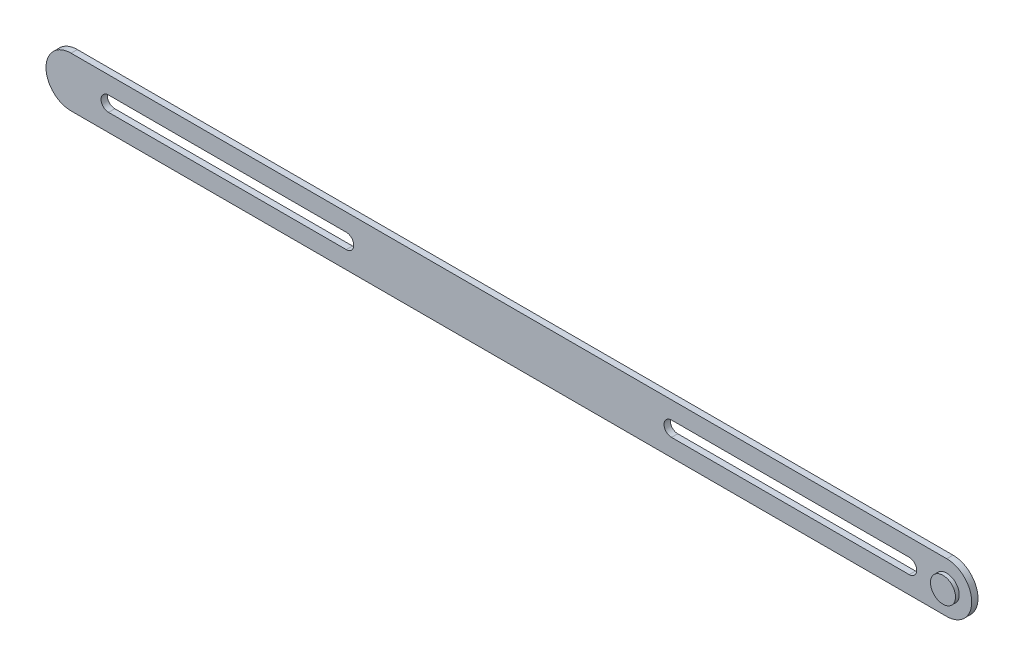
ISO-10303-21;
HEADER;
FILE_DESCRIPTION(('STEP AP214'),'2;1');
FILE_NAME('part.step','',(''),(''),'','','');
FILE_SCHEMA(('AUTOMOTIVE_DESIGN { 1 0 10303 214 1 1 1 1 }'));
ENDSEC;
DATA;
#1=APPLICATION_CONTEXT('core data for automotive mechanical design processes');
#2=APPLICATION_PROTOCOL_DEFINITION('international standard','automotive_design',2000,#1);
#3=PRODUCT_CONTEXT('',#1,'mechanical');
#4=PRODUCT('Part','Part','',(#3));
#5=PRODUCT_RELATED_PRODUCT_CATEGORY('part','',(#4));
#6=PRODUCT_DEFINITION_FORMATION('','',#4);
#7=PRODUCT_DEFINITION_CONTEXT('part definition',#1,'design');
#8=PRODUCT_DEFINITION('design','',#6,#7);
#9=PRODUCT_DEFINITION_SHAPE('','',#8);
#10=(LENGTH_UNIT() NAMED_UNIT(*) SI_UNIT(.MILLI.,.METRE.));
#11=(NAMED_UNIT(*) PLANE_ANGLE_UNIT() SI_UNIT($,.RADIAN.));
#12=(NAMED_UNIT(*) SI_UNIT($,.STERADIAN.) SOLID_ANGLE_UNIT());
#13=UNCERTAINTY_MEASURE_WITH_UNIT(LENGTH_MEASURE(1.E-05),#10,'distance_accuracy_value','');
#14=(GEOMETRIC_REPRESENTATION_CONTEXT(3) GLOBAL_UNCERTAINTY_ASSIGNED_CONTEXT((#13)) GLOBAL_UNIT_ASSIGNED_CONTEXT((#10,
#11,#12)) REPRESENTATION_CONTEXT('',''));
#15=CARTESIAN_POINT('',(0.,0.,0.));
#16=DIRECTION('',(0.,0.,1.));
#17=DIRECTION('',(1.,0.,0.));
#18=AXIS2_PLACEMENT_3D('',#15,#16,#17);
#19=CARTESIAN_POINT('',(0.,0.,4.));
#20=DIRECTION('',(0.,0.,-1.));
#21=DIRECTION('',(-1.,0.,0.));
#22=AXIS2_PLACEMENT_3D('',#19,#20,#21);
#23=CYLINDRICAL_SURFACE('',#22,2.5);
#24=CARTESIAN_POINT('',(0.,0.,4.));
#25=DIRECTION('',(0.,0.,1.));
#26=DIRECTION('',(1.,0.,0.));
#27=AXIS2_PLACEMENT_3D('',#24,#25,#26);
#28=CIRCLE('',#27,2.5);
#29=CARTESIAN_POINT('',(2.5,0.,4.));
#30=VERTEX_POINT('',#29);
#31=EDGE_CURVE('E11',#30,#30,#28,.T.);
#32=ORIENTED_EDGE('',*,*,#31,.F.);
#33=EDGE_LOOP('',(#32));
#34=FACE_BOUND('',#33,.T.);
#35=CARTESIAN_POINT('',(0.,0.,0.));
#36=DIRECTION('',(0.,0.,1.));
#37=DIRECTION('',(1.,0.,0.));
#38=AXIS2_PLACEMENT_3D('',#35,#36,#37);
#39=CIRCLE('',#38,2.5);
#40=CARTESIAN_POINT('',(2.5,0.,0.));
#41=VERTEX_POINT('',#40);
#42=EDGE_CURVE('E35',#41,#41,#39,.T.);
#43=ORIENTED_EDGE('',*,*,#42,.T.);
#44=EDGE_LOOP('',(#43));
#45=FACE_BOUND('',#44,.T.);
#46=ADVANCED_FACE('F32',(#34,#45),#23,.T.);
#47=CARTESIAN_POINT('',(0.,0.,0.));
#48=DIRECTION('',(0.,0.,1.));
#49=DIRECTION('',(1.,0.,0.));
#50=AXIS2_PLACEMENT_3D('',#47,#48,#49);
#51=PLANE('',#50);
#52=ORIENTED_EDGE('',*,*,#42,.F.);
#53=EDGE_LOOP('',(#52));
#54=FACE_BOUND('',#53,.T.);
#55=ADVANCED_FACE('F227',(#54),#51,.F.);
#56=CARTESIAN_POINT('',(0.,0.,6.5));
#57=DIRECTION('',(0.,0.,1.));
#58=DIRECTION('',(1.,0.,0.));
#59=AXIS2_PLACEMENT_3D('',#56,#57,#58);
#60=PLANE('',#59);
#61=DIRECTION('',(1.,0.,0.));
#62=VECTOR('',#61,1.);
#63=CARTESIAN_POINT('',(15.,-3.,6.5));
#64=LINE('',#63,#62);
#65=CARTESIAN_POINT('',(15.,-3.,6.5));
#66=VERTEX_POINT('',#65);
#67=CARTESIAN_POINT('',(110.,-2.99999999999997,6.5));
#68=VERTEX_POINT('',#67);
#69=EDGE_CURVE('E164',#66,#68,#64,.T.);
#70=ORIENTED_EDGE('',*,*,#69,.F.);
#71=CARTESIAN_POINT('',(15.,0.,6.5));
#72=DIRECTION('',(0.,0.,1.));
#73=DIRECTION('',(1.,0.,0.));
#74=AXIS2_PLACEMENT_3D('',#71,#72,#73);
#75=CIRCLE('',#74,3.);
#76=CARTESIAN_POINT('',(15.,3.,6.5));
#77=VERTEX_POINT('',#76);
#78=EDGE_CURVE('E162',#77,#66,#75,.T.);
#79=ORIENTED_EDGE('',*,*,#78,.F.);
#80=DIRECTION('',(-1.,0.,0.));
#81=VECTOR('',#80,1.);
#82=CARTESIAN_POINT('',(15.,3.,6.5));
#83=LINE('',#82,#81);
#84=CARTESIAN_POINT('',(110.,3.00000000000003,6.5));
#85=VERTEX_POINT('',#84);
#86=EDGE_CURVE('E170',#85,#77,#83,.T.);
#87=ORIENTED_EDGE('',*,*,#86,.F.);
#88=CARTESIAN_POINT('',(110.,0.,6.5));
#89=DIRECTION('',(0.,0.,1.));
#90=DIRECTION('',(1.,0.,0.));
#91=AXIS2_PLACEMENT_3D('',#88,#89,#90);
#92=CIRCLE('',#91,3.);
#93=EDGE_CURVE('E167',#68,#85,#92,.T.);
#94=ORIENTED_EDGE('',*,*,#93,.F.);
#95=EDGE_LOOP('',(#70,#79,#87,#94));
#96=FACE_BOUND('',#95,.T.);
#97=CARTESIAN_POINT('',(0.,0.,6.5));
#98=DIRECTION('',(0.,0.,1.));
#99=DIRECTION('',(1.,0.,0.));
#100=AXIS2_PLACEMENT_3D('',#97,#98,#99);
#101=CIRCLE('',#100,10.);
#102=CARTESIAN_POINT('',(0.,10.,6.5));
#103=VERTEX_POINT('',#102);
#104=CARTESIAN_POINT('',(0.,-10.,6.5));
#105=VERTEX_POINT('',#104);
#106=EDGE_CURVE('E193',#103,#105,#101,.T.);
#107=ORIENTED_EDGE('',*,*,#106,.T.);
#108=DIRECTION('',(1.,0.,0.));
#109=VECTOR('',#108,1.);
#110=CARTESIAN_POINT('',(0.,-10.,6.5));
#111=LINE('',#110,#109);
#112=CARTESIAN_POINT('',(350.,-10.,6.5));
#113=VERTEX_POINT('',#112);
#114=EDGE_CURVE('E196',#105,#113,#111,.T.);
#115=ORIENTED_EDGE('',*,*,#114,.T.);
#116=CARTESIAN_POINT('',(350.,0.,6.5));
#117=DIRECTION('',(0.,0.,1.));
#118=DIRECTION('',(1.,0.,0.));
#119=AXIS2_PLACEMENT_3D('',#116,#117,#118);
#120=CIRCLE('',#119,10.);
#121=CARTESIAN_POINT('',(350.,10.,6.5));
#122=VERTEX_POINT('',#121);
#123=EDGE_CURVE('E199',#113,#122,#120,.T.);
#124=ORIENTED_EDGE('',*,*,#123,.T.);
#125=DIRECTION('',(-1.,0.,0.));
#126=VECTOR('',#125,1.);
#127=CARTESIAN_POINT('',(0.,10.,6.5));
#128=LINE('',#127,#126);
#129=EDGE_CURVE('E201',#122,#103,#128,.T.);
#130=ORIENTED_EDGE('',*,*,#129,.T.);
#131=EDGE_LOOP('',(#107,#115,#124,#130));
#132=FACE_BOUND('',#131,.T.);
#133=CARTESIAN_POINT('',(350.,0.,6.5));
#134=DIRECTION('',(0.,0.,1.));
#135=DIRECTION('',(1.,0.,0.));
#136=AXIS2_PLACEMENT_3D('',#133,#134,#135);
#137=CIRCLE('',#136,4.99999999999999);
#138=CARTESIAN_POINT('',(355.,0.,6.5));
#139=VERTEX_POINT('',#138);
#140=EDGE_CURVE('E136',#139,#139,#137,.T.);
#141=ORIENTED_EDGE('',*,*,#140,.F.);
#142=EDGE_LOOP('',(#141));
#143=FACE_BOUND('',#142,.T.);
#144=DIRECTION('',(-1.,0.,0.));
#145=VECTOR('',#144,1.);
#146=CARTESIAN_POINT('',(335.,3.00000000000043,6.5));
#147=LINE('',#146,#145);
#148=CARTESIAN_POINT('',(335.,3.00000000000043,6.5));
#149=VERTEX_POINT('',#148);
#150=CARTESIAN_POINT('',(240.,3.00000000000021,6.5));
#151=VERTEX_POINT('',#150);
#152=EDGE_CURVE('E128',#149,#151,#147,.T.);
#153=ORIENTED_EDGE('',*,*,#152,.F.);
#154=CARTESIAN_POINT('',(335.,4.33743710432076E-13,6.5));
#155=DIRECTION('',(0.,0.,1.));
#156=DIRECTION('',(-1.,0.,0.));
#157=AXIS2_PLACEMENT_3D('',#154,#155,#156);
#158=CIRCLE('',#157,3.);
#159=CARTESIAN_POINT('',(335.,-2.99999999999957,6.5));
#160=VERTEX_POINT('',#159);
#161=EDGE_CURVE('E120',#160,#149,#158,.T.);
#162=ORIENTED_EDGE('',*,*,#161,.F.);
#163=DIRECTION('',(1.,0.,0.));
#164=VECTOR('',#163,1.);
#165=CARTESIAN_POINT('',(335.,-2.99999999999957,6.5));
#166=LINE('',#165,#164);
#167=CARTESIAN_POINT('',(240.,-2.99999999999979,6.5));
#168=VERTEX_POINT('',#167);
#169=EDGE_CURVE('E143',#168,#160,#166,.T.);
#170=ORIENTED_EDGE('',*,*,#169,.F.);
#171=CARTESIAN_POINT('',(240.,2.08082655684684E-13,6.5));
#172=DIRECTION('',(0.,0.,1.));
#173=DIRECTION('',(-1.,0.,0.));
#174=AXIS2_PLACEMENT_3D('',#171,#172,#173);
#175=CIRCLE('',#174,3.);
#176=EDGE_CURVE('E141',#151,#168,#175,.T.);
#177=ORIENTED_EDGE('',*,*,#176,.F.);
#178=EDGE_LOOP('',(#153,#162,#170,#177));
#179=FACE_BOUND('',#178,.T.);
#180=ADVANCED_FACE('F140',(#96,#132,#143,#179),#60,.T.);
#181=CARTESIAN_POINT('',(0.,0.,4.));
#182=DIRECTION('',(0.,0.,1.));
#183=DIRECTION('',(1.,0.,0.));
#184=AXIS2_PLACEMENT_3D('',#181,#182,#183);
#185=PLANE('',#184);
#186=ORIENTED_EDGE('',*,*,#31,.T.);
#187=EDGE_LOOP('',(#186));
#188=FACE_BOUND('',#187,.T.);
#189=CARTESIAN_POINT('',(350.,0.,4.));
#190=DIRECTION('',(0.,0.,1.));
#191=DIRECTION('',(1.,0.,0.));
#192=AXIS2_PLACEMENT_3D('',#189,#190,#191);
#193=CIRCLE('',#192,4.99999999999999);
#194=CARTESIAN_POINT('',(355.,0.,4.));
#195=VERTEX_POINT('',#194);
#196=EDGE_CURVE('E149',#195,#195,#193,.T.);
#197=ORIENTED_EDGE('',*,*,#196,.T.);
#198=EDGE_LOOP('',(#197));
#199=FACE_BOUND('',#198,.T.);
#200=CARTESIAN_POINT('',(15.,0.,4.));
#201=DIRECTION('',(0.,0.,1.));
#202=DIRECTION('',(1.,0.,0.));
#203=AXIS2_PLACEMENT_3D('',#200,#201,#202);
#204=CIRCLE('',#203,3.);
#205=CARTESIAN_POINT('',(15.,3.,4.));
#206=VERTEX_POINT('',#205);
#207=CARTESIAN_POINT('',(15.,-3.,4.));
#208=VERTEX_POINT('',#207);
#209=EDGE_CURVE('E161',#206,#208,#204,.T.);
#210=ORIENTED_EDGE('',*,*,#209,.T.);
#211=DIRECTION('',(1.,0.,0.));
#212=VECTOR('',#211,1.);
#213=CARTESIAN_POINT('',(15.,-3.,4.));
#214=LINE('',#213,#212);
#215=CARTESIAN_POINT('',(110.,-2.99999999999997,4.));
#216=VERTEX_POINT('',#215);
#217=EDGE_CURVE('E175',#208,#216,#214,.T.);
#218=ORIENTED_EDGE('',*,*,#217,.T.);
#219=CARTESIAN_POINT('',(110.,0.,4.));
#220=DIRECTION('',(0.,0.,1.));
#221=DIRECTION('',(1.,0.,0.));
#222=AXIS2_PLACEMENT_3D('',#219,#220,#221);
#223=CIRCLE('',#222,3.);
#224=CARTESIAN_POINT('',(110.,3.00000000000003,4.));
#225=VERTEX_POINT('',#224);
#226=EDGE_CURVE('E178',#216,#225,#223,.T.);
#227=ORIENTED_EDGE('',*,*,#226,.T.);
#228=DIRECTION('',(-1.,0.,0.));
#229=VECTOR('',#228,1.);
#230=CARTESIAN_POINT('',(15.,3.,4.));
#231=LINE('',#230,#229);
#232=EDGE_CURVE('E165',#225,#206,#231,.T.);
#233=ORIENTED_EDGE('',*,*,#232,.T.);
#234=EDGE_LOOP('',(#210,#218,#227,#233));
#235=FACE_BOUND('',#234,.T.);
#236=CARTESIAN_POINT('',(0.,0.,4.));
#237=DIRECTION('',(0.,0.,1.));
#238=DIRECTION('',(1.,0.,0.));
#239=AXIS2_PLACEMENT_3D('',#236,#237,#238);
#240=CIRCLE('',#239,10.);
#241=CARTESIAN_POINT('',(0.,10.,4.));
#242=VERTEX_POINT('',#241);
#243=CARTESIAN_POINT('',(0.,-10.,4.));
#244=VERTEX_POINT('',#243);
#245=EDGE_CURVE('E192',#242,#244,#240,.T.);
#246=ORIENTED_EDGE('',*,*,#245,.F.);
#247=DIRECTION('',(-1.,0.,0.));
#248=VECTOR('',#247,1.);
#249=CARTESIAN_POINT('',(0.,10.,4.));
#250=LINE('',#249,#248);
#251=CARTESIAN_POINT('',(350.,10.,4.));
#252=VERTEX_POINT('',#251);
#253=EDGE_CURVE('E197',#252,#242,#250,.T.);
#254=ORIENTED_EDGE('',*,*,#253,.F.);
#255=CARTESIAN_POINT('',(350.,0.,4.));
#256=DIRECTION('',(0.,0.,1.));
#257=DIRECTION('',(1.,0.,0.));
#258=AXIS2_PLACEMENT_3D('',#255,#256,#257);
#259=CIRCLE('',#258,10.);
#260=CARTESIAN_POINT('',(350.,-10.,4.));
#261=VERTEX_POINT('',#260);
#262=EDGE_CURVE('E208',#261,#252,#259,.T.);
#263=ORIENTED_EDGE('',*,*,#262,.F.);
#264=DIRECTION('',(1.,0.,0.));
#265=VECTOR('',#264,1.);
#266=CARTESIAN_POINT('',(0.,-10.,4.));
#267=LINE('',#266,#265);
#268=EDGE_CURVE('E206',#244,#261,#267,.T.);
#269=ORIENTED_EDGE('',*,*,#268,.F.);
#270=EDGE_LOOP('',(#246,#254,#263,#269));
#271=FACE_BOUND('',#270,.T.);
#272=CARTESIAN_POINT('',(335.,4.33743710432076E-13,4.));
#273=DIRECTION('',(0.,0.,1.));
#274=DIRECTION('',(-1.,0.,0.));
#275=AXIS2_PLACEMENT_3D('',#272,#273,#274);
#276=CIRCLE('',#275,3.);
#277=CARTESIAN_POINT('',(335.,-2.99999999999957,4.));
#278=VERTEX_POINT('',#277);
#279=CARTESIAN_POINT('',(335.,3.00000000000043,4.));
#280=VERTEX_POINT('',#279);
#281=EDGE_CURVE('E54',#278,#280,#276,.T.);
#282=ORIENTED_EDGE('',*,*,#281,.T.);
#283=DIRECTION('',(-1.,0.,0.));
#284=VECTOR('',#283,1.);
#285=CARTESIAN_POINT('',(335.,3.00000000000043,4.));
#286=LINE('',#285,#284);
#287=CARTESIAN_POINT('',(240.,3.00000000000021,4.));
#288=VERTEX_POINT('',#287);
#289=EDGE_CURVE('E135',#280,#288,#286,.T.);
#290=ORIENTED_EDGE('',*,*,#289,.T.);
#291=CARTESIAN_POINT('',(240.,2.08082655684684E-13,4.));
#292=DIRECTION('',(0.,0.,1.));
#293=DIRECTION('',(-1.,0.,0.));
#294=AXIS2_PLACEMENT_3D('',#291,#292,#293);
#295=CIRCLE('',#294,3.);
#296=CARTESIAN_POINT('',(240.,-2.99999999999979,4.));
#297=VERTEX_POINT('',#296);
#298=EDGE_CURVE('E151',#288,#297,#295,.T.);
#299=ORIENTED_EDGE('',*,*,#298,.T.);
#300=DIRECTION('',(1.,0.,0.));
#301=VECTOR('',#300,1.);
#302=CARTESIAN_POINT('',(335.,-2.99999999999957,4.));
#303=LINE('',#302,#301);
#304=EDGE_CURVE('E129',#297,#278,#303,.T.);
#305=ORIENTED_EDGE('',*,*,#304,.T.);
#306=EDGE_LOOP('',(#282,#290,#299,#305));
#307=FACE_BOUND('',#306,.T.);
#308=ADVANCED_FACE('F233',(#188,#199,#235,#271,#307),#185,.F.);
#309=CARTESIAN_POINT('',(0.,0.,6.5));
#310=DIRECTION('',(0.,0.,-1.));
#311=DIRECTION('',(-1.,0.,0.));
#312=AXIS2_PLACEMENT_3D('',#309,#310,#311);
#313=CYLINDRICAL_SURFACE('',#312,10.);
#314=ORIENTED_EDGE('',*,*,#245,.T.);
#315=DIRECTION('',(0.,0.,-1.));
#316=VECTOR('',#315,1.);
#317=CARTESIAN_POINT('',(0.,-10.,6.5));
#318=LINE('',#317,#316);
#319=EDGE_CURVE('E219',#105,#244,#318,.T.);
#320=ORIENTED_EDGE('',*,*,#319,.F.);
#321=ORIENTED_EDGE('',*,*,#106,.F.);
#322=DIRECTION('',(0.,0.,-1.));
#323=VECTOR('',#322,1.);
#324=CARTESIAN_POINT('',(0.,10.,6.5));
#325=LINE('',#324,#323);
#326=EDGE_CURVE('E203',#103,#242,#325,.T.);
#327=ORIENTED_EDGE('',*,*,#326,.T.);
#328=EDGE_LOOP('',(#314,#320,#321,#327));
#329=FACE_BOUND('',#328,.T.);
#330=ADVANCED_FACE('F238',(#329),#313,.T.);
#331=CARTESIAN_POINT('',(0.,-10.,6.5));
#332=DIRECTION('',(0.,1.,0.));
#333=DIRECTION('',(0.,0.,1.));
#334=AXIS2_PLACEMENT_3D('',#331,#332,#333);
#335=PLANE('',#334);
#336=ORIENTED_EDGE('',*,*,#268,.T.);
#337=DIRECTION('',(0.,0.,-1.));
#338=VECTOR('',#337,1.);
#339=CARTESIAN_POINT('',(350.,-10.,6.5));
#340=LINE('',#339,#338);
#341=EDGE_CURVE('E216',#113,#261,#340,.T.);
#342=ORIENTED_EDGE('',*,*,#341,.F.);
#343=ORIENTED_EDGE('',*,*,#114,.F.);
#344=ORIENTED_EDGE('',*,*,#319,.T.);
#345=EDGE_LOOP('',(#336,#342,#343,#344));
#346=FACE_BOUND('',#345,.T.);
#347=ADVANCED_FACE('F241',(#346),#335,.F.);
#348=CARTESIAN_POINT('',(350.,0.,6.5));
#349=DIRECTION('',(0.,0.,-1.));
#350=DIRECTION('',(-1.,0.,0.));
#351=AXIS2_PLACEMENT_3D('',#348,#349,#350);
#352=CYLINDRICAL_SURFACE('',#351,10.);
#353=ORIENTED_EDGE('',*,*,#262,.T.);
#354=DIRECTION('',(0.,0.,-1.));
#355=VECTOR('',#354,1.);
#356=CARTESIAN_POINT('',(350.,10.,6.5));
#357=LINE('',#356,#355);
#358=EDGE_CURVE('E213',#122,#252,#357,.T.);
#359=ORIENTED_EDGE('',*,*,#358,.F.);
#360=ORIENTED_EDGE('',*,*,#123,.F.);
#361=ORIENTED_EDGE('',*,*,#341,.T.);
#362=EDGE_LOOP('',(#353,#359,#360,#361));
#363=FACE_BOUND('',#362,.T.);
#364=ADVANCED_FACE('F245',(#363),#352,.T.);
#365=CARTESIAN_POINT('',(0.,10.,6.5));
#366=DIRECTION('',(0.,-1.,0.));
#367=DIRECTION('',(0.,0.,-1.));
#368=AXIS2_PLACEMENT_3D('',#365,#366,#367);
#369=PLANE('',#368);
#370=ORIENTED_EDGE('',*,*,#253,.T.);
#371=ORIENTED_EDGE('',*,*,#326,.F.);
#372=ORIENTED_EDGE('',*,*,#129,.F.);
#373=ORIENTED_EDGE('',*,*,#358,.T.);
#374=EDGE_LOOP('',(#370,#371,#372,#373));
#375=FACE_BOUND('',#374,.T.);
#376=ADVANCED_FACE('F248',(#375),#369,.F.);
#377=CARTESIAN_POINT('',(15.,0.,6.5));
#378=DIRECTION('',(0.,0.,-1.));
#379=DIRECTION('',(-1.,0.,0.));
#380=AXIS2_PLACEMENT_3D('',#377,#378,#379);
#381=CYLINDRICAL_SURFACE('',#380,3.);
#382=ORIENTED_EDGE('',*,*,#209,.F.);
#383=DIRECTION('',(0.,0.,-1.));
#384=VECTOR('',#383,1.);
#385=CARTESIAN_POINT('',(15.,3.,6.5));
#386=LINE('',#385,#384);
#387=EDGE_CURVE('E172',#77,#206,#386,.T.);
#388=ORIENTED_EDGE('',*,*,#387,.F.);
#389=ORIENTED_EDGE('',*,*,#78,.T.);
#390=DIRECTION('',(0.,0.,-1.));
#391=VECTOR('',#390,1.);
#392=CARTESIAN_POINT('',(15.,-3.,6.5));
#393=LINE('',#392,#391);
#394=EDGE_CURVE('E189',#66,#208,#393,.T.);
#395=ORIENTED_EDGE('',*,*,#394,.T.);
#396=EDGE_LOOP('',(#382,#388,#389,#395));
#397=FACE_BOUND('',#396,.T.);
#398=ADVANCED_FACE('F252',(#397),#381,.F.);
#399=CARTESIAN_POINT('',(15.,-3.,6.5));
#400=DIRECTION('',(0.,1.,0.));
#401=DIRECTION('',(-1.,0.,0.));
#402=AXIS2_PLACEMENT_3D('',#399,#400,#401);
#403=PLANE('',#402);
#404=ORIENTED_EDGE('',*,*,#217,.F.);
#405=ORIENTED_EDGE('',*,*,#394,.F.);
#406=ORIENTED_EDGE('',*,*,#69,.T.);
#407=DIRECTION('',(0.,0.,-1.));
#408=VECTOR('',#407,1.);
#409=CARTESIAN_POINT('',(110.,-2.99999999999997,6.5));
#410=LINE('',#409,#408);
#411=EDGE_CURVE('E187',#68,#216,#410,.T.);
#412=ORIENTED_EDGE('',*,*,#411,.T.);
#413=EDGE_LOOP('',(#404,#405,#406,#412));
#414=FACE_BOUND('',#413,.T.);
#415=ADVANCED_FACE('F259',(#414),#403,.T.);
#416=CARTESIAN_POINT('',(110.,0.,6.5));
#417=DIRECTION('',(0.,0.,-1.));
#418=DIRECTION('',(-1.,0.,0.));
#419=AXIS2_PLACEMENT_3D('',#416,#417,#418);
#420=CYLINDRICAL_SURFACE('',#419,3.);
#421=ORIENTED_EDGE('',*,*,#226,.F.);
#422=ORIENTED_EDGE('',*,*,#411,.F.);
#423=ORIENTED_EDGE('',*,*,#93,.T.);
#424=DIRECTION('',(0.,0.,-1.));
#425=VECTOR('',#424,1.);
#426=CARTESIAN_POINT('',(110.,3.00000000000003,6.5));
#427=LINE('',#426,#425);
#428=EDGE_CURVE('E185',#85,#225,#427,.T.);
#429=ORIENTED_EDGE('',*,*,#428,.T.);
#430=EDGE_LOOP('',(#421,#422,#423,#429));
#431=FACE_BOUND('',#430,.T.);
#432=ADVANCED_FACE('F263',(#431),#420,.F.);
#433=CARTESIAN_POINT('',(15.,3.,6.5));
#434=DIRECTION('',(0.,-1.,0.));
#435=DIRECTION('',(1.,0.,0.));
#436=AXIS2_PLACEMENT_3D('',#433,#434,#435);
#437=PLANE('',#436);
#438=ORIENTED_EDGE('',*,*,#232,.F.);
#439=ORIENTED_EDGE('',*,*,#428,.F.);
#440=ORIENTED_EDGE('',*,*,#86,.T.);
#441=ORIENTED_EDGE('',*,*,#387,.T.);
#442=EDGE_LOOP('',(#438,#439,#440,#441));
#443=FACE_BOUND('',#442,.T.);
#444=ADVANCED_FACE('F267',(#443),#437,.T.);
#445=CARTESIAN_POINT('',(335.,4.33743710432076E-13,6.5));
#446=DIRECTION('',(0.,0.,-1.));
#447=DIRECTION('',(-1.,0.,0.));
#448=AXIS2_PLACEMENT_3D('',#445,#446,#447);
#449=CYLINDRICAL_SURFACE('',#448,3.);
#450=ORIENTED_EDGE('',*,*,#281,.F.);
#451=DIRECTION('',(0.,0.,-1.));
#452=VECTOR('',#451,1.);
#453=CARTESIAN_POINT('',(335.,-2.99999999999957,6.5));
#454=LINE('',#453,#452);
#455=EDGE_CURVE('E124',#160,#278,#454,.T.);
#456=ORIENTED_EDGE('',*,*,#455,.F.);
#457=ORIENTED_EDGE('',*,*,#161,.T.);
#458=DIRECTION('',(0.,0.,-1.));
#459=VECTOR('',#458,1.);
#460=CARTESIAN_POINT('',(335.,3.00000000000043,6.5));
#461=LINE('',#460,#459);
#462=EDGE_CURVE('E123',#149,#280,#461,.T.);
#463=ORIENTED_EDGE('',*,*,#462,.T.);
#464=EDGE_LOOP('',(#450,#456,#457,#463));
#465=FACE_BOUND('',#464,.T.);
#466=ADVANCED_FACE('F122',(#465),#449,.F.);
#467=CARTESIAN_POINT('',(335.,3.00000000000043,6.5));
#468=DIRECTION('',(0.,-1.,0.));
#469=DIRECTION('',(1.,0.,0.));
#470=AXIS2_PLACEMENT_3D('',#467,#468,#469);
#471=PLANE('',#470);
#472=ORIENTED_EDGE('',*,*,#289,.F.);
#473=ORIENTED_EDGE('',*,*,#462,.F.);
#474=ORIENTED_EDGE('',*,*,#152,.T.);
#475=DIRECTION('',(0.,0.,-1.));
#476=VECTOR('',#475,1.);
#477=CARTESIAN_POINT('',(240.,3.00000000000021,6.5));
#478=LINE('',#477,#476);
#479=EDGE_CURVE('E137',#151,#288,#478,.T.);
#480=ORIENTED_EDGE('',*,*,#479,.T.);
#481=EDGE_LOOP('',(#472,#473,#474,#480));
#482=FACE_BOUND('',#481,.T.);
#483=ADVANCED_FACE('F132',(#482),#471,.T.);
#484=CARTESIAN_POINT('',(240.,2.08082655684684E-13,6.5));
#485=DIRECTION('',(0.,0.,-1.));
#486=DIRECTION('',(-1.,0.,0.));
#487=AXIS2_PLACEMENT_3D('',#484,#485,#486);
#488=CYLINDRICAL_SURFACE('',#487,3.);
#489=ORIENTED_EDGE('',*,*,#298,.F.);
#490=ORIENTED_EDGE('',*,*,#479,.F.);
#491=ORIENTED_EDGE('',*,*,#176,.T.);
#492=DIRECTION('',(0.,0.,-1.));
#493=VECTOR('',#492,1.);
#494=CARTESIAN_POINT('',(240.,-2.99999999999979,6.5));
#495=LINE('',#494,#493);
#496=EDGE_CURVE('E46',#168,#297,#495,.T.);
#497=ORIENTED_EDGE('',*,*,#496,.T.);
#498=EDGE_LOOP('',(#489,#490,#491,#497));
#499=FACE_BOUND('',#498,.T.);
#500=ADVANCED_FACE('F276',(#499),#488,.F.);
#501=CARTESIAN_POINT('',(335.,-2.99999999999957,6.5));
#502=DIRECTION('',(0.,1.,0.));
#503=DIRECTION('',(-1.,0.,0.));
#504=AXIS2_PLACEMENT_3D('',#501,#502,#503);
#505=PLANE('',#504);
#506=ORIENTED_EDGE('',*,*,#304,.F.);
#507=ORIENTED_EDGE('',*,*,#496,.F.);
#508=ORIENTED_EDGE('',*,*,#169,.T.);
#509=ORIENTED_EDGE('',*,*,#455,.T.);
#510=EDGE_LOOP('',(#506,#507,#508,#509));
#511=FACE_BOUND('',#510,.T.);
#512=ADVANCED_FACE('F279',(#511),#505,.T.);
#513=CARTESIAN_POINT('',(350.,0.,0.5));
#514=DIRECTION('',(0.,0.,-1.));
#515=DIRECTION('',(-1.,0.,0.));
#516=AXIS2_PLACEMENT_3D('',#513,#514,#515);
#517=PLANE('',#516);
#518=CARTESIAN_POINT('',(350.,0.,0.5));
#519=DIRECTION('',(0.,0.,-1.));
#520=DIRECTION('',(-1.,0.,0.));
#521=AXIS2_PLACEMENT_3D('',#518,#519,#520);
#522=CIRCLE('',#521,4.99999999999999);
#523=CARTESIAN_POINT('',(345.,0.,0.5));
#524=VERTEX_POINT('',#523);
#525=EDGE_CURVE('E301',#524,#524,#522,.T.);
#526=ORIENTED_EDGE('',*,*,#525,.T.);
#527=EDGE_LOOP('',(#526));
#528=FACE_BOUND('',#527,.T.);
#529=ADVANCED_FACE('F283',(#528),#517,.T.);
#530=CARTESIAN_POINT('',(350.,0.,8.));
#531=DIRECTION('',(0.,0.,-1.));
#532=DIRECTION('',(-1.,0.,0.));
#533=AXIS2_PLACEMENT_3D('',#530,#531,#532);
#534=CYLINDRICAL_SURFACE('',#533,4.99999999999999);
#535=ORIENTED_EDGE('',*,*,#525,.F.);
#536=EDGE_LOOP('',(#535));
#537=FACE_BOUND('',#536,.T.);
#538=ORIENTED_EDGE('',*,*,#196,.F.);
#539=EDGE_LOOP('',(#538));
#540=FACE_BOUND('',#539,.T.);
#541=ADVANCED_FACE('F288',(#537,#540),#534,.T.);
#542=ORIENTED_EDGE('',*,*,#140,.T.);
#543=EDGE_LOOP('',(#542));
#544=FACE_BOUND('',#543,.T.);
#545=CARTESIAN_POINT('',(350.,0.,8.));
#546=DIRECTION('',(0.,0.,-1.));
#547=DIRECTION('',(-1.,0.,0.));
#548=AXIS2_PLACEMENT_3D('',#545,#546,#547);
#549=CIRCLE('',#548,4.99999999999999);
#550=CARTESIAN_POINT('',(345.,0.,8.));
#551=VERTEX_POINT('',#550);
#552=EDGE_CURVE('E302',#551,#551,#549,.T.);
#553=ORIENTED_EDGE('',*,*,#552,.T.);
#554=EDGE_LOOP('',(#553));
#555=FACE_BOUND('',#554,.T.);
#556=ADVANCED_FACE('F284',(#544,#555),#534,.T.);
#557=CARTESIAN_POINT('',(350.,0.,8.));
#558=DIRECTION('',(0.,0.,-1.));
#559=DIRECTION('',(-1.,0.,0.));
#560=AXIS2_PLACEMENT_3D('',#557,#558,#559);
#561=PLANE('',#560);
#562=ORIENTED_EDGE('',*,*,#552,.F.);
#563=EDGE_LOOP('',(#562));
#564=FACE_BOUND('',#563,.T.);
#565=ADVANCED_FACE('F287',(#564),#561,.F.);
#566=CLOSED_SHELL('',(#46,#55,#180,#308,#330,#347,#364,#376,#398,#415,#432,#444,#466,#483,#500,
#512,#529,#541,#556,#565));
#567=MANIFOLD_SOLID_BREP('B2',#566);
#568=ADVANCED_BREP_SHAPE_REPRESENTATION('',(#18,#567),#14);
#569=SHAPE_DEFINITION_REPRESENTATION(#9,#568);
ENDSEC;
END-ISO-10303-21;
